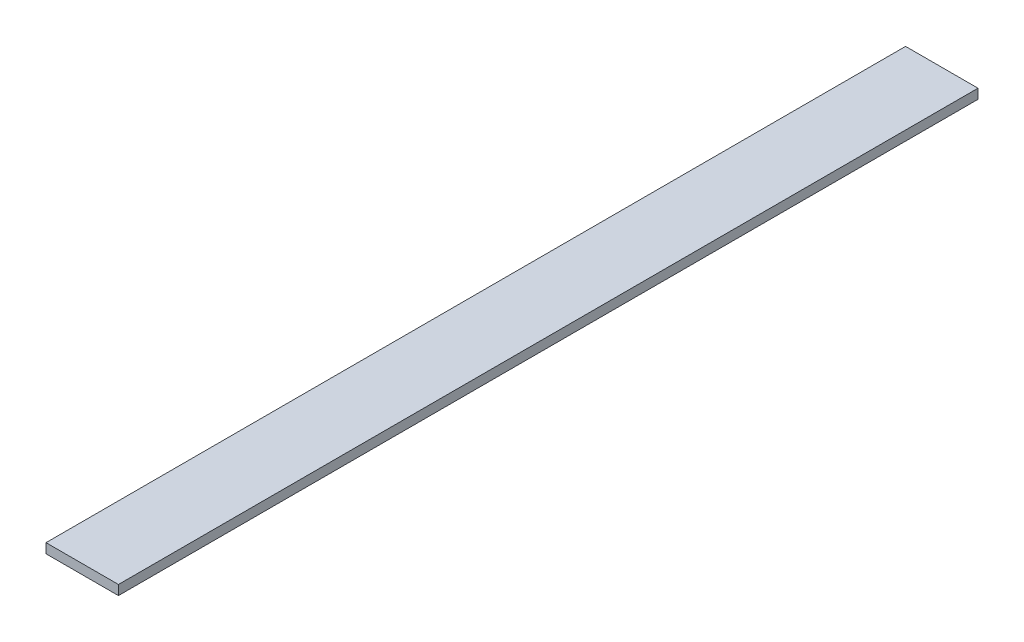
ISO-10303-21;
HEADER;
FILE_DESCRIPTION(('STEP AP214'),'2;1');
FILE_NAME('part.step','',(''),(''),'','','');
FILE_SCHEMA(('AUTOMOTIVE_DESIGN { 1 0 10303 214 1 1 1 1 }'));
ENDSEC;
DATA;
#1=APPLICATION_CONTEXT('core data for automotive mechanical design processes');
#2=APPLICATION_PROTOCOL_DEFINITION('international standard','automotive_design',2000,#1);
#3=PRODUCT_CONTEXT('',#1,'mechanical');
#4=PRODUCT('Part','Part','',(#3));
#5=PRODUCT_RELATED_PRODUCT_CATEGORY('part','',(#4));
#6=PRODUCT_DEFINITION_FORMATION('','',#4);
#7=PRODUCT_DEFINITION_CONTEXT('part definition',#1,'design');
#8=PRODUCT_DEFINITION('design','',#6,#7);
#9=PRODUCT_DEFINITION_SHAPE('','',#8);
#10=(LENGTH_UNIT() NAMED_UNIT(*) SI_UNIT(.MILLI.,.METRE.));
#11=(NAMED_UNIT(*) PLANE_ANGLE_UNIT() SI_UNIT($,.RADIAN.));
#12=(NAMED_UNIT(*) SI_UNIT($,.STERADIAN.) SOLID_ANGLE_UNIT());
#13=UNCERTAINTY_MEASURE_WITH_UNIT(LENGTH_MEASURE(1.E-05),#10,'distance_accuracy_value','');
#14=(GEOMETRIC_REPRESENTATION_CONTEXT(3) GLOBAL_UNCERTAINTY_ASSIGNED_CONTEXT((#13)) GLOBAL_UNIT_ASSIGNED_CONTEXT((#10,
#11,#12)) REPRESENTATION_CONTEXT('',''));
#15=CARTESIAN_POINT('',(0.,0.,0.));
#16=DIRECTION('',(0.,0.,1.));
#17=DIRECTION('',(1.,0.,0.));
#18=AXIS2_PLACEMENT_3D('',#15,#16,#17);
#19=CARTESIAN_POINT('',(7.5,1.,-178.));
#20=DIRECTION('',(-1.,0.,0.));
#21=DIRECTION('',(0.,-1.,0.));
#22=AXIS2_PLACEMENT_3D('',#19,#20,#21);
#23=PLANE('',#22);
#24=DIRECTION('',(0.,1.,0.));
#25=VECTOR('',#24,1.);
#26=CARTESIAN_POINT('',(7.5,1.,0.));
#27=LINE('',#26,#25);
#28=CARTESIAN_POINT('',(7.5,-1.,0.));
#29=VERTEX_POINT('',#28);
#30=CARTESIAN_POINT('',(7.5,1.,0.));
#31=VERTEX_POINT('',#30);
#32=EDGE_CURVE('E104',#29,#31,#27,.T.);
#33=ORIENTED_EDGE('',*,*,#32,.F.);
#34=DIRECTION('',(0.,0.,1.));
#35=VECTOR('',#34,1.);
#36=CARTESIAN_POINT('',(7.5,-1.,-178.));
#37=LINE('',#36,#35);
#38=CARTESIAN_POINT('',(7.5,-1.,-178.));
#39=VERTEX_POINT('',#38);
#40=EDGE_CURVE('E103',#39,#29,#37,.T.);
#41=ORIENTED_EDGE('',*,*,#40,.F.);
#42=DIRECTION('',(0.,1.,0.));
#43=VECTOR('',#42,1.);
#44=CARTESIAN_POINT('',(7.5,1.,-178.));
#45=LINE('',#44,#43);
#46=CARTESIAN_POINT('',(7.5,1.,-178.));
#47=VERTEX_POINT('',#46);
#48=EDGE_CURVE('E98',#39,#47,#45,.T.);
#49=ORIENTED_EDGE('',*,*,#48,.T.);
#50=DIRECTION('',(0.,0.,1.));
#51=VECTOR('',#50,1.);
#52=CARTESIAN_POINT('',(7.5,1.,-178.));
#53=LINE('',#52,#51);
#54=EDGE_CURVE('E11',#47,#31,#53,.T.);
#55=ORIENTED_EDGE('',*,*,#54,.T.);
#56=EDGE_LOOP('',(#33,#41,#49,#55));
#57=FACE_BOUND('',#56,.T.);
#58=ADVANCED_FACE('F41',(#57),#23,.F.);
#59=CARTESIAN_POINT('',(-7.5,1.,-178.));
#60=DIRECTION('',(0.,-1.,0.));
#61=DIRECTION('',(0.,0.,1.));
#62=AXIS2_PLACEMENT_3D('',#59,#60,#61);
#63=PLANE('',#62);
#64=DIRECTION('',(-1.,0.,0.));
#65=VECTOR('',#64,1.);
#66=CARTESIAN_POINT('',(-7.5,1.,0.));
#67=LINE('',#66,#65);
#68=CARTESIAN_POINT('',(-7.5,1.,0.));
#69=VERTEX_POINT('',#68);
#70=EDGE_CURVE('E106',#31,#69,#67,.T.);
#71=ORIENTED_EDGE('',*,*,#70,.F.);
#72=ORIENTED_EDGE('',*,*,#54,.F.);
#73=DIRECTION('',(-1.,0.,0.));
#74=VECTOR('',#73,1.);
#75=CARTESIAN_POINT('',(-7.5,1.,-178.));
#76=LINE('',#75,#74);
#77=CARTESIAN_POINT('',(-7.5,1.,-178.));
#78=VERTEX_POINT('',#77);
#79=EDGE_CURVE('E82',#47,#78,#76,.T.);
#80=ORIENTED_EDGE('',*,*,#79,.T.);
#81=DIRECTION('',(0.,0.,1.));
#82=VECTOR('',#81,1.);
#83=CARTESIAN_POINT('',(-7.5,1.,-178.));
#84=LINE('',#83,#82);
#85=EDGE_CURVE('E49',#78,#69,#84,.T.);
#86=ORIENTED_EDGE('',*,*,#85,.T.);
#87=EDGE_LOOP('',(#71,#72,#80,#86));
#88=FACE_BOUND('',#87,.T.);
#89=ADVANCED_FACE('F96',(#88),#63,.F.);
#90=CARTESIAN_POINT('',(-7.5,1.,-178.));
#91=DIRECTION('',(1.,0.,0.));
#92=DIRECTION('',(0.,0.,1.));
#93=AXIS2_PLACEMENT_3D('',#90,#91,#92);
#94=PLANE('',#93);
#95=DIRECTION('',(0.,-1.,0.));
#96=VECTOR('',#95,1.);
#97=CARTESIAN_POINT('',(-7.5,1.,0.));
#98=LINE('',#97,#96);
#99=CARTESIAN_POINT('',(-7.5,-1.,0.));
#100=VERTEX_POINT('',#99);
#101=EDGE_CURVE('E92',#69,#100,#98,.T.);
#102=ORIENTED_EDGE('',*,*,#101,.F.);
#103=ORIENTED_EDGE('',*,*,#85,.F.);
#104=DIRECTION('',(0.,-1.,0.));
#105=VECTOR('',#104,1.);
#106=CARTESIAN_POINT('',(-7.5,1.,-178.));
#107=LINE('',#106,#105);
#108=CARTESIAN_POINT('',(-7.5,-1.,-178.));
#109=VERTEX_POINT('',#108);
#110=EDGE_CURVE('E85',#78,#109,#107,.T.);
#111=ORIENTED_EDGE('',*,*,#110,.T.);
#112=DIRECTION('',(0.,0.,1.));
#113=VECTOR('',#112,1.);
#114=CARTESIAN_POINT('',(-7.5,-1.,-178.));
#115=LINE('',#114,#113);
#116=EDGE_CURVE('E95',#109,#100,#115,.T.);
#117=ORIENTED_EDGE('',*,*,#116,.T.);
#118=EDGE_LOOP('',(#102,#103,#111,#117));
#119=FACE_BOUND('',#118,.T.);
#120=ADVANCED_FACE('F91',(#119),#94,.F.);
#121=CARTESIAN_POINT('',(-7.5,-1.,-178.));
#122=DIRECTION('',(0.,1.,0.));
#123=DIRECTION('',(0.,0.,-1.));
#124=AXIS2_PLACEMENT_3D('',#121,#122,#123);
#125=PLANE('',#124);
#126=DIRECTION('',(1.,0.,0.));
#127=VECTOR('',#126,1.);
#128=CARTESIAN_POINT('',(-7.5,-1.,0.));
#129=LINE('',#128,#127);
#130=EDGE_CURVE('E71',#100,#29,#129,.T.);
#131=ORIENTED_EDGE('',*,*,#130,.F.);
#132=ORIENTED_EDGE('',*,*,#116,.F.);
#133=DIRECTION('',(1.,0.,0.));
#134=VECTOR('',#133,1.);
#135=CARTESIAN_POINT('',(-7.5,-1.,-178.));
#136=LINE('',#135,#134);
#137=EDGE_CURVE('E57',#109,#39,#136,.T.);
#138=ORIENTED_EDGE('',*,*,#137,.T.);
#139=ORIENTED_EDGE('',*,*,#40,.T.);
#140=EDGE_LOOP('',(#131,#132,#138,#139));
#141=FACE_BOUND('',#140,.T.);
#142=ADVANCED_FACE('F115',(#141),#125,.F.);
#143=CARTESIAN_POINT('',(0.,0.,-178.));
#144=DIRECTION('',(0.,0.,-1.));
#145=DIRECTION('',(1.,0.,0.));
#146=AXIS2_PLACEMENT_3D('',#143,#144,#145);
#147=PLANE('',#146);
#148=ORIENTED_EDGE('',*,*,#48,.F.);
#149=ORIENTED_EDGE('',*,*,#137,.F.);
#150=ORIENTED_EDGE('',*,*,#110,.F.);
#151=ORIENTED_EDGE('',*,*,#79,.F.);
#152=EDGE_LOOP('',(#148,#149,#150,#151));
#153=FACE_BOUND('',#152,.T.);
#154=ADVANCED_FACE('F87',(#153),#147,.T.);
#155=CARTESIAN_POINT('',(0.,0.,0.));
#156=DIRECTION('',(0.,0.,-1.));
#157=DIRECTION('',(1.,0.,0.));
#158=AXIS2_PLACEMENT_3D('',#155,#156,#157);
#159=PLANE('',#158);
#160=ORIENTED_EDGE('',*,*,#32,.T.);
#161=ORIENTED_EDGE('',*,*,#70,.T.);
#162=ORIENTED_EDGE('',*,*,#101,.T.);
#163=ORIENTED_EDGE('',*,*,#130,.T.);
#164=EDGE_LOOP('',(#160,#161,#162,#163));
#165=FACE_BOUND('',#164,.T.);
#166=ADVANCED_FACE('F111',(#165),#159,.F.);
#167=CLOSED_SHELL('',(#58,#89,#120,#142,#154,#166));
#168=MANIFOLD_SOLID_BREP('B2',#167);
#169=ADVANCED_BREP_SHAPE_REPRESENTATION('',(#18,#168),#14);
#170=SHAPE_DEFINITION_REPRESENTATION(#9,#169);
ENDSEC;
END-ISO-10303-21;
